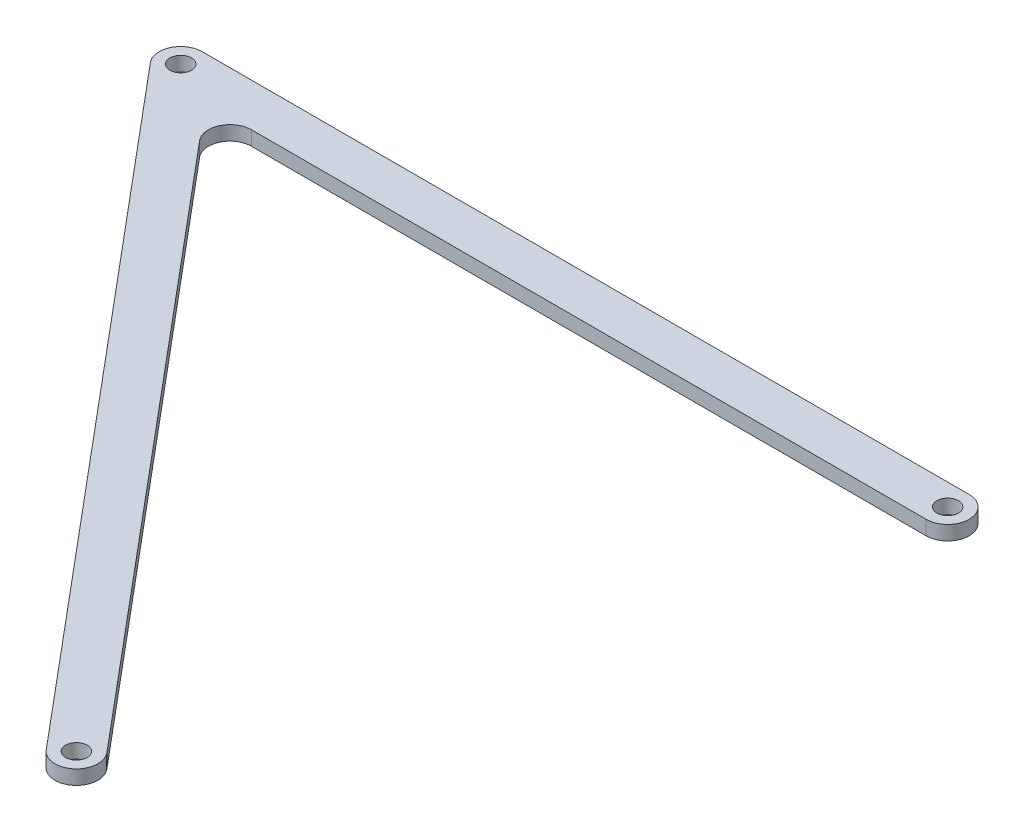
ISO-10303-21;
HEADER;
FILE_DESCRIPTION(('STEP AP214'),'2;1');
FILE_NAME('part.step','',(''),(''),'','','');
FILE_SCHEMA(('AUTOMOTIVE_DESIGN { 1 0 10303 214 1 1 1 1 }'));
ENDSEC;
DATA;
#1=APPLICATION_CONTEXT('core data for automotive mechanical design processes');
#2=APPLICATION_PROTOCOL_DEFINITION('international standard','automotive_design',2000,#1);
#3=PRODUCT_CONTEXT('',#1,'mechanical');
#4=PRODUCT('Part','Part','',(#3));
#5=PRODUCT_RELATED_PRODUCT_CATEGORY('part','',(#4));
#6=PRODUCT_DEFINITION_FORMATION('','',#4);
#7=PRODUCT_DEFINITION_CONTEXT('part definition',#1,'design');
#8=PRODUCT_DEFINITION('design','',#6,#7);
#9=PRODUCT_DEFINITION_SHAPE('','',#8);
#10=(LENGTH_UNIT() NAMED_UNIT(*) SI_UNIT(.MILLI.,.METRE.));
#11=(NAMED_UNIT(*) PLANE_ANGLE_UNIT() SI_UNIT($,.RADIAN.));
#12=(NAMED_UNIT(*) SI_UNIT($,.STERADIAN.) SOLID_ANGLE_UNIT());
#13=UNCERTAINTY_MEASURE_WITH_UNIT(LENGTH_MEASURE(1.E-05),#10,'distance_accuracy_value','');
#14=(GEOMETRIC_REPRESENTATION_CONTEXT(3) GLOBAL_UNCERTAINTY_ASSIGNED_CONTEXT((#13)) GLOBAL_UNIT_ASSIGNED_CONTEXT((#10,
#11,#12)) REPRESENTATION_CONTEXT('',''));
#15=CARTESIAN_POINT('',(0.,0.,0.));
#16=DIRECTION('',(0.,0.,1.));
#17=DIRECTION('',(1.,0.,0.));
#18=AXIS2_PLACEMENT_3D('',#15,#16,#17);
#19=CARTESIAN_POINT('',(0.,0.,0.));
#20=DIRECTION('',(0.,1.,0.));
#21=DIRECTION('',(0.,0.,1.));
#22=AXIS2_PLACEMENT_3D('',#19,#20,#21);
#23=PLANE('',#22);
#24=CARTESIAN_POINT('',(378.815113114848,0.,451.560701066669));
#25=DIRECTION('',(0.,1.,0.));
#26=DIRECTION('',(0.,0.,1.));
#27=AXIS2_PLACEMENT_3D('',#24,#25,#26);
#28=CIRCLE('',#27,7.50000000000001);
#29=CARTESIAN_POINT('',(378.815113114848,0.,459.060701066669));
#30=VERTEX_POINT('',#29);
#31=EDGE_CURVE('E250',#30,#30,#28,.T.);
#32=ORIENTED_EDGE('',*,*,#31,.T.);
#33=EDGE_LOOP('',(#32));
#34=FACE_BOUND('',#33,.T.);
#35=CARTESIAN_POINT('',(535.,0.,0.));
#36=DIRECTION('',(0.,1.,0.));
#37=DIRECTION('',(0.,0.,1.));
#38=AXIS2_PLACEMENT_3D('',#35,#36,#37);
#39=CIRCLE('',#38,7.49999999999996);
#40=CARTESIAN_POINT('',(535.,0.,7.49999999999996));
#41=VERTEX_POINT('',#40);
#42=EDGE_CURVE('E253',#41,#41,#39,.T.);
#43=ORIENTED_EDGE('',*,*,#42,.T.);
#44=EDGE_LOOP('',(#43));
#45=FACE_BOUND('',#44,.T.);
#46=CARTESIAN_POINT('',(0.,0.,0.));
#47=DIRECTION('',(0.,1.,0.));
#48=DIRECTION('',(0.,0.,1.));
#49=AXIS2_PLACEMENT_3D('',#46,#47,#48);
#50=CIRCLE('',#49,7.5);
#51=CARTESIAN_POINT('',(0.,0.,7.5));
#52=VERTEX_POINT('',#51);
#53=EDGE_CURVE('E151',#52,#52,#50,.T.);
#54=ORIENTED_EDGE('',*,*,#53,.T.);
#55=EDGE_LOOP('',(#54));
#56=FACE_BOUND('',#55,.T.);
#57=CARTESIAN_POINT('',(378.815113114848,0.,451.560701066669));
#58=DIRECTION('',(0.,1.,0.));
#59=DIRECTION('',(0.,0.,1.));
#60=AXIS2_PLACEMENT_3D('',#57,#58,#59);
#61=CIRCLE('',#60,15.0000000000001);
#62=CARTESIAN_POINT('',(390.305779761638,0.,441.918886921377));
#63=VERTEX_POINT('',#62);
#64=CARTESIAN_POINT('',(368.296658670312,0.,462.254723513729));
#65=VERTEX_POINT('',#64);
#66=EDGE_CURVE('E113',#63,#65,#61,.F.);
#67=ORIENTED_EDGE('',*,*,#66,.T.);
#68=DIRECTION('',(0.642787609686505,0.,0.766044443119007));
#69=VECTOR('',#68,1.);
#70=CARTESIAN_POINT('',(-11.49066664678,0.,9.641814145298));
#71=LINE('',#70,#69);
#72=CARTESIAN_POINT('',(-11.4906666467812,0.,9.64181414529662));
#73=VERTEX_POINT('',#72);
#74=EDGE_CURVE('E110',#73,#65,#71,.T.);
#75=ORIENTED_EDGE('',*,*,#74,.F.);
#76=CARTESIAN_POINT('',(0.,0.,0.));
#77=DIRECTION('',(0.,1.,0.));
#78=DIRECTION('',(0.,0.,1.));
#79=AXIS2_PLACEMENT_3D('',#76,#77,#78);
#80=CIRCLE('',#79,15.);
#81=CARTESIAN_POINT('',(0.,0.,-15.));
#82=VERTEX_POINT('',#81);
#83=EDGE_CURVE('E98',#82,#73,#80,.T.);
#84=ORIENTED_EDGE('',*,*,#83,.F.);
#85=DIRECTION('',(-1.,0.,0.));
#86=VECTOR('',#85,1.);
#87=CARTESIAN_POINT('',(550.,0.,-15.));
#88=LINE('',#87,#86);
#89=CARTESIAN_POINT('',(535.,0.,-15.));
#90=VERTEX_POINT('',#89);
#91=EDGE_CURVE('E128',#90,#82,#88,.T.);
#92=ORIENTED_EDGE('',*,*,#91,.F.);
#93=CARTESIAN_POINT('',(535.,0.,0.));
#94=DIRECTION('',(0.,-1.,0.));
#95=DIRECTION('',(0.,0.,-1.));
#96=AXIS2_PLACEMENT_3D('',#93,#94,#95);
#97=CIRCLE('',#96,15.);
#98=CARTESIAN_POINT('',(535.,0.,15.));
#99=VERTEX_POINT('',#98);
#100=EDGE_CURVE('E154',#99,#90,#97,.F.);
#101=ORIENTED_EDGE('',*,*,#100,.F.);
#102=DIRECTION('',(1.,0.,0.));
#103=VECTOR('',#102,1.);
#104=CARTESIAN_POINT('',(64.33520761529,0.,15.));
#105=LINE('',#104,#103);
#106=CARTESIAN_POINT('',(64.33520761529,0.,15.));
#107=VERTEX_POINT('',#106);
#108=EDGE_CURVE('E129',#107,#99,#105,.T.);
#109=ORIENTED_EDGE('',*,*,#108,.F.);
#110=CARTESIAN_POINT('',(64.33520761529,0.,30.));
#111=DIRECTION('',(0.,1.,0.));
#112=DIRECTION('',(0.,0.,1.));
#113=AXIS2_PLACEMENT_3D('',#110,#111,#112);
#114=CIRCLE('',#113,15.);
#115=CARTESIAN_POINT('',(52.8445409685073,0.,39.6418141452948));
#116=VERTEX_POINT('',#115);
#117=EDGE_CURVE('E157',#107,#116,#114,.T.);
#118=ORIENTED_EDGE('',*,*,#117,.T.);
#119=DIRECTION('',(-0.642787609686505,0.,-0.766044443119007));
#120=VECTOR('',#119,1.);
#121=CARTESIAN_POINT('',(400.,0.,453.3655796348));
#122=LINE('',#121,#120);
#123=CARTESIAN_POINT('',(390.358185854703,0.,441.874912988015));
#124=VERTEX_POINT('',#123);
#125=EDGE_CURVE('E38',#124,#116,#122,.T.);
#126=ORIENTED_EDGE('',*,*,#125,.F.);
#127=DIRECTION('',(-0.766044443119341,0.,0.642787609686107));
#128=VECTOR('',#127,1.);
#129=CARTESIAN_POINT('',(378.867519207668,0.,451.516727133511));
#130=LINE('',#129,#128);
#131=EDGE_CURVE('E202',#124,#63,#130,.T.);
#132=ORIENTED_EDGE('',*,*,#131,.T.);
#133=EDGE_LOOP('',(#67,#75,#84,#92,#101,#109,#118,#126,#132));
#134=FACE_BOUND('',#133,.T.);
#135=ADVANCED_FACE('F35',(#34,#45,#56,#134),#23,.F.);
#136=CARTESIAN_POINT('',(550.,0.,-15.));
#137=DIRECTION('',(0.,0.,-1.));
#138=DIRECTION('',(-1.,0.,0.));
#139=AXIS2_PLACEMENT_3D('',#136,#137,#138);
#140=PLANE('',#139);
#141=DIRECTION('',(1.,0.,0.));
#142=VECTOR('',#141,1.);
#143=CARTESIAN_POINT('',(0.,10.,-15.));
#144=LINE('',#143,#142);
#145=CARTESIAN_POINT('',(535.,10.,-15.));
#146=VERTEX_POINT('',#145);
#147=CARTESIAN_POINT('',(0.,10.,-15.));
#148=VERTEX_POINT('',#147);
#149=EDGE_CURVE('E150',#146,#148,#144,.F.);
#150=ORIENTED_EDGE('',*,*,#149,.F.);
#151=DIRECTION('',(0.,-1.,0.));
#152=VECTOR('',#151,1.);
#153=CARTESIAN_POINT('',(535.,0.,-15.));
#154=LINE('',#153,#152);
#155=EDGE_CURVE('E131',#90,#146,#154,.F.);
#156=ORIENTED_EDGE('',*,*,#155,.F.);
#157=ORIENTED_EDGE('',*,*,#91,.T.);
#158=DIRECTION('',(0.,1.,0.));
#159=VECTOR('',#158,1.);
#160=CARTESIAN_POINT('',(0.,0.,-15.));
#161=LINE('',#160,#159);
#162=EDGE_CURVE('E105',#148,#82,#161,.F.);
#163=ORIENTED_EDGE('',*,*,#162,.F.);
#164=EDGE_LOOP('',(#150,#156,#157,#163));
#165=FACE_BOUND('',#164,.T.);
#166=ADVANCED_FACE('F205',(#165),#140,.T.);
#167=CARTESIAN_POINT('',(0.,0.,0.));
#168=DIRECTION('',(0.,1.,0.));
#169=DIRECTION('',(0.,0.,1.));
#170=AXIS2_PLACEMENT_3D('',#167,#168,#169);
#171=CYLINDRICAL_SURFACE('',#170,15.);
#172=ORIENTED_EDGE('',*,*,#162,.T.);
#173=ORIENTED_EDGE('',*,*,#83,.T.);
#174=DIRECTION('',(0.,1.,0.));
#175=VECTOR('',#174,1.);
#176=CARTESIAN_POINT('',(-11.49066664678,0.,9.641814145298));
#177=LINE('',#176,#175);
#178=CARTESIAN_POINT('',(-11.4906666467813,10.,9.64181414529646));
#179=VERTEX_POINT('',#178);
#180=EDGE_CURVE('E103',#179,#73,#177,.F.);
#181=ORIENTED_EDGE('',*,*,#180,.F.);
#182=CARTESIAN_POINT('',(0.,10.,0.));
#183=DIRECTION('',(0.,1.,0.));
#184=DIRECTION('',(0.,0.,1.));
#185=AXIS2_PLACEMENT_3D('',#182,#183,#184);
#186=CIRCLE('',#185,15.);
#187=EDGE_CURVE('E148',#148,#179,#186,.T.);
#188=ORIENTED_EDGE('',*,*,#187,.F.);
#189=EDGE_LOOP('',(#172,#173,#181,#188));
#190=FACE_BOUND('',#189,.T.);
#191=ADVANCED_FACE('F100',(#190),#171,.T.);
#192=CARTESIAN_POINT('',(-11.49066664678,0.,9.641814145298));
#193=DIRECTION('',(-0.766044443119007,0.,0.642787609686505));
#194=DIRECTION('',(0.642787609686505,0.,0.766044443119007));
#195=AXIS2_PLACEMENT_3D('',#192,#193,#194);
#196=PLANE('',#195);
#197=DIRECTION('',(0.,1.,0.));
#198=VECTOR('',#197,1.);
#199=CARTESIAN_POINT('',(368.296658670312,-0.000103077695698395,462.254723513729));
#200=LINE('',#199,#198);
#201=CARTESIAN_POINT('',(368.296658670188,10.,462.254723513607));
#202=VERTEX_POINT('',#201);
#203=EDGE_CURVE('E201',#202,#65,#200,.F.);
#204=ORIENTED_EDGE('',*,*,#203,.F.);
#205=DIRECTION('',(0.642787609686484,0.,0.766044443119025));
#206=VECTOR('',#205,1.);
#207=CARTESIAN_POINT('',(-11.49066664678,10.,9.641814145298));
#208=LINE('',#207,#206);
#209=EDGE_CURVE('E120',#179,#202,#208,.T.);
#210=ORIENTED_EDGE('',*,*,#209,.F.);
#211=ORIENTED_EDGE('',*,*,#180,.T.);
#212=ORIENTED_EDGE('',*,*,#74,.T.);
#213=EDGE_LOOP('',(#204,#210,#211,#212));
#214=FACE_BOUND('',#213,.T.);
#215=ADVANCED_FACE('F118',(#214),#196,.T.);
#216=CARTESIAN_POINT('',(400.,0.,453.3655796348));
#217=DIRECTION('',(0.766044443119007,0.,-0.642787609686505));
#218=DIRECTION('',(-0.642787609686505,0.,-0.766044443119007));
#219=AXIS2_PLACEMENT_3D('',#216,#217,#218);
#220=PLANE('',#219);
#221=DIRECTION('',(0.,1.,0.));
#222=VECTOR('',#221,1.);
#223=CARTESIAN_POINT('',(390.358185854703,0.,441.874912988015));
#224=LINE('',#223,#222);
#225=CARTESIAN_POINT('',(390.358185854702,10.,441.874912988015));
#226=VERTEX_POINT('',#225);
#227=EDGE_CURVE('E51',#124,#226,#224,.T.);
#228=ORIENTED_EDGE('',*,*,#227,.F.);
#229=ORIENTED_EDGE('',*,*,#125,.T.);
#230=DIRECTION('',(0.,1.,0.));
#231=VECTOR('',#230,1.);
#232=CARTESIAN_POINT('',(52.8445409685041,0.,39.6418141452966));
#233=LINE('',#232,#231);
#234=CARTESIAN_POINT('',(52.8445409685026,10.,39.6418141452989));
#235=VERTEX_POINT('',#234);
#236=EDGE_CURVE('E125',#116,#235,#233,.T.);
#237=ORIENTED_EDGE('',*,*,#236,.T.);
#238=DIRECTION('',(-0.642787609686523,0.,-0.766044443118992));
#239=VECTOR('',#238,1.);
#240=CARTESIAN_POINT('',(400.,10.,453.3655796348));
#241=LINE('',#240,#239);
#242=EDGE_CURVE('E147',#226,#235,#241,.T.);
#243=ORIENTED_EDGE('',*,*,#242,.F.);
#244=EDGE_LOOP('',(#228,#229,#237,#243));
#245=FACE_BOUND('',#244,.T.);
#246=ADVANCED_FACE('F179',(#245),#220,.T.);
#247=CARTESIAN_POINT('',(64.33520761529,0.,30.));
#248=DIRECTION('',(0.,1.,0.));
#249=DIRECTION('',(0.,0.,1.));
#250=AXIS2_PLACEMENT_3D('',#247,#248,#249);
#251=CYLINDRICAL_SURFACE('',#250,15.);
#252=CARTESIAN_POINT('',(64.33520761529,10.,30.));
#253=DIRECTION('',(0.,1.,0.));
#254=DIRECTION('',(0.,0.,1.));
#255=AXIS2_PLACEMENT_3D('',#252,#253,#254);
#256=CIRCLE('',#255,15.);
#257=CARTESIAN_POINT('',(64.33520761529,10.,15.));
#258=VERTEX_POINT('',#257);
#259=EDGE_CURVE('E144',#235,#258,#256,.F.);
#260=ORIENTED_EDGE('',*,*,#259,.F.);
#261=ORIENTED_EDGE('',*,*,#236,.F.);
#262=ORIENTED_EDGE('',*,*,#117,.F.);
#263=DIRECTION('',(0.,1.,0.));
#264=VECTOR('',#263,1.);
#265=CARTESIAN_POINT('',(64.33520761529,0.,15.));
#266=LINE('',#265,#264);
#267=EDGE_CURVE('E132',#258,#107,#266,.F.);
#268=ORIENTED_EDGE('',*,*,#267,.F.);
#269=EDGE_LOOP('',(#260,#261,#262,#268));
#270=FACE_BOUND('',#269,.T.);
#271=ADVANCED_FACE('F182',(#270),#251,.F.);
#272=CARTESIAN_POINT('',(64.33520761529,0.,15.));
#273=DIRECTION('',(0.,0.,1.));
#274=DIRECTION('',(1.,0.,0.));
#275=AXIS2_PLACEMENT_3D('',#272,#273,#274);
#276=PLANE('',#275);
#277=ORIENTED_EDGE('',*,*,#108,.T.);
#278=DIRECTION('',(0.,-1.,0.));
#279=VECTOR('',#278,1.);
#280=CARTESIAN_POINT('',(535.,0.,15.));
#281=LINE('',#280,#279);
#282=CARTESIAN_POINT('',(535.,10.,15.));
#283=VERTEX_POINT('',#282);
#284=EDGE_CURVE('E60',#283,#99,#281,.T.);
#285=ORIENTED_EDGE('',*,*,#284,.F.);
#286=DIRECTION('',(1.,0.,0.));
#287=VECTOR('',#286,1.);
#288=CARTESIAN_POINT('',(0.,10.,15.));
#289=LINE('',#288,#287);
#290=EDGE_CURVE('E143',#258,#283,#289,.T.);
#291=ORIENTED_EDGE('',*,*,#290,.F.);
#292=ORIENTED_EDGE('',*,*,#267,.T.);
#293=EDGE_LOOP('',(#277,#285,#291,#292));
#294=FACE_BOUND('',#293,.T.);
#295=ADVANCED_FACE('F210',(#294),#276,.T.);
#296=CARTESIAN_POINT('',(535.,0.,0.));
#297=DIRECTION('',(0.,-1.,0.));
#298=DIRECTION('',(0.,0.,-1.));
#299=AXIS2_PLACEMENT_3D('',#296,#297,#298);
#300=CYLINDRICAL_SURFACE('',#299,15.);
#301=ORIENTED_EDGE('',*,*,#284,.T.);
#302=ORIENTED_EDGE('',*,*,#100,.T.);
#303=ORIENTED_EDGE('',*,*,#155,.T.);
#304=CARTESIAN_POINT('',(535.,10.,0.));
#305=DIRECTION('',(0.,-1.,0.));
#306=DIRECTION('',(0.,0.,-1.));
#307=AXIS2_PLACEMENT_3D('',#304,#305,#306);
#308=CIRCLE('',#307,15.);
#309=EDGE_CURVE('E140',#283,#146,#308,.F.);
#310=ORIENTED_EDGE('',*,*,#309,.F.);
#311=EDGE_LOOP('',(#301,#302,#303,#310));
#312=FACE_BOUND('',#311,.T.);
#313=ADVANCED_FACE('F207',(#312),#300,.T.);
#314=CARTESIAN_POINT('',(0.,0.,0.));
#315=DIRECTION('',(0.,1.,0.));
#316=DIRECTION('',(0.,0.,1.));
#317=AXIS2_PLACEMENT_3D('',#314,#315,#316);
#318=CYLINDRICAL_SURFACE('',#317,7.5);
#319=CARTESIAN_POINT('',(0.,10.,0.));
#320=DIRECTION('',(0.,1.,0.));
#321=DIRECTION('',(0.,0.,1.));
#322=AXIS2_PLACEMENT_3D('',#319,#320,#321);
#323=CIRCLE('',#322,7.5);
#324=CARTESIAN_POINT('',(0.,10.,7.5));
#325=VERTEX_POINT('',#324);
#326=EDGE_CURVE('E137',#325,#325,#323,.F.);
#327=ORIENTED_EDGE('',*,*,#326,.F.);
#328=EDGE_LOOP('',(#327));
#329=FACE_BOUND('',#328,.T.);
#330=ORIENTED_EDGE('',*,*,#53,.F.);
#331=EDGE_LOOP('',(#330));
#332=FACE_BOUND('',#331,.T.);
#333=ADVANCED_FACE('F218',(#329,#332),#318,.F.);
#334=CARTESIAN_POINT('',(0.,10.,0.));
#335=DIRECTION('',(0.,1.,0.));
#336=DIRECTION('',(0.,0.,1.));
#337=AXIS2_PLACEMENT_3D('',#334,#335,#336);
#338=PLANE('',#337);
#339=CARTESIAN_POINT('',(378.815113114848,10.,451.560701066669));
#340=DIRECTION('',(0.,1.,0.));
#341=DIRECTION('',(0.,0.,1.));
#342=AXIS2_PLACEMENT_3D('',#339,#340,#341);
#343=CIRCLE('',#342,7.50000000000001);
#344=CARTESIAN_POINT('',(378.815113114848,10.,459.060701066669));
#345=VERTEX_POINT('',#344);
#346=EDGE_CURVE('E252',#345,#345,#343,.T.);
#347=ORIENTED_EDGE('',*,*,#346,.F.);
#348=EDGE_LOOP('',(#347));
#349=FACE_BOUND('',#348,.T.);
#350=CARTESIAN_POINT('',(535.,10.,0.));
#351=DIRECTION('',(0.,1.,0.));
#352=DIRECTION('',(0.,0.,1.));
#353=AXIS2_PLACEMENT_3D('',#350,#351,#352);
#354=CIRCLE('',#353,7.49999999999996);
#355=CARTESIAN_POINT('',(535.,10.,7.49999999999996));
#356=VERTEX_POINT('',#355);
#357=EDGE_CURVE('E257',#356,#356,#354,.T.);
#358=ORIENTED_EDGE('',*,*,#357,.F.);
#359=EDGE_LOOP('',(#358));
#360=FACE_BOUND('',#359,.T.);
#361=CARTESIAN_POINT('',(378.815113114848,10.,451.560701066669));
#362=DIRECTION('',(0.,1.,0.));
#363=DIRECTION('',(0.,0.,1.));
#364=AXIS2_PLACEMENT_3D('',#361,#362,#363);
#365=CIRCLE('',#364,15.0000000000001);
#366=CARTESIAN_POINT('',(390.305779761638,10.,441.918886921377));
#367=VERTEX_POINT('',#366);
#368=EDGE_CURVE('E11',#367,#202,#365,.F.);
#369=ORIENTED_EDGE('',*,*,#368,.F.);
#370=DIRECTION('',(-0.766044443119341,0.,0.642787609686107));
#371=VECTOR('',#370,1.);
#372=CARTESIAN_POINT('',(378.867519207668,10.,451.516727133511));
#373=LINE('',#372,#371);
#374=EDGE_CURVE('E44',#226,#367,#373,.T.);
#375=ORIENTED_EDGE('',*,*,#374,.F.);
#376=ORIENTED_EDGE('',*,*,#242,.T.);
#377=ORIENTED_EDGE('',*,*,#259,.T.);
#378=ORIENTED_EDGE('',*,*,#290,.T.);
#379=ORIENTED_EDGE('',*,*,#309,.T.);
#380=ORIENTED_EDGE('',*,*,#149,.T.);
#381=ORIENTED_EDGE('',*,*,#187,.T.);
#382=ORIENTED_EDGE('',*,*,#209,.T.);
#383=EDGE_LOOP('',(#369,#375,#376,#377,#378,#379,#380,#381,#382));
#384=FACE_BOUND('',#383,.T.);
#385=ORIENTED_EDGE('',*,*,#326,.T.);
#386=EDGE_LOOP('',(#385));
#387=FACE_BOUND('',#386,.T.);
#388=ADVANCED_FACE('F186',(#349,#360,#384,#387),#338,.T.);
#389=CARTESIAN_POINT('',(378.815113114848,-0.000103077695698395,451.560701066669));
#390=DIRECTION('',(0.,1.,0.));
#391=DIRECTION('',(0.,0.,1.));
#392=AXIS2_PLACEMENT_3D('',#389,#390,#391);
#393=CYLINDRICAL_SURFACE('',#392,15.0000000000001);
#394=DIRECTION('',(0.,1.,0.));
#395=VECTOR('',#394,1.);
#396=CARTESIAN_POINT('',(390.305779761638,-0.000103077695698395,441.918886921377));
#397=LINE('',#396,#395);
#398=EDGE_CURVE('E193',#63,#367,#397,.T.);
#399=ORIENTED_EDGE('',*,*,#398,.T.);
#400=ORIENTED_EDGE('',*,*,#368,.T.);
#401=ORIENTED_EDGE('',*,*,#203,.T.);
#402=ORIENTED_EDGE('',*,*,#66,.F.);
#403=EDGE_LOOP('',(#399,#400,#401,#402));
#404=FACE_BOUND('',#403,.T.);
#405=ADVANCED_FACE('F200',(#404),#393,.T.);
#406=CARTESIAN_POINT('',(390.305779761638,-0.000103077695698395,441.918886921377));
#407=DIRECTION('',(-0.642787609686107,0.,-0.766044443119341));
#408=DIRECTION('',(-0.766044443119341,0.,0.642787609686107));
#409=AXIS2_PLACEMENT_3D('',#406,#407,#408);
#410=PLANE('',#409);
#411=ORIENTED_EDGE('',*,*,#227,.T.);
#412=ORIENTED_EDGE('',*,*,#374,.T.);
#413=ORIENTED_EDGE('',*,*,#398,.F.);
#414=ORIENTED_EDGE('',*,*,#131,.F.);
#415=EDGE_LOOP('',(#411,#412,#413,#414));
#416=FACE_BOUND('',#415,.T.);
#417=ADVANCED_FACE('F191',(#416),#410,.F.);
#418=CARTESIAN_POINT('',(535.,0.,0.));
#419=DIRECTION('',(0.,1.,0.));
#420=DIRECTION('',(0.,0.,1.));
#421=AXIS2_PLACEMENT_3D('',#418,#419,#420);
#422=CYLINDRICAL_SURFACE('',#421,7.49999999999996);
#423=ORIENTED_EDGE('',*,*,#42,.F.);
#424=EDGE_LOOP('',(#423));
#425=FACE_BOUND('',#424,.T.);
#426=ORIENTED_EDGE('',*,*,#357,.T.);
#427=EDGE_LOOP('',(#426));
#428=FACE_BOUND('',#427,.T.);
#429=ADVANCED_FACE('F237',(#425,#428),#422,.F.);
#430=CARTESIAN_POINT('',(378.815113114848,0.,451.560701066669));
#431=DIRECTION('',(0.,1.,0.));
#432=DIRECTION('',(0.,0.,1.));
#433=AXIS2_PLACEMENT_3D('',#430,#431,#432);
#434=CYLINDRICAL_SURFACE('',#433,7.50000000000001);
#435=ORIENTED_EDGE('',*,*,#31,.F.);
#436=EDGE_LOOP('',(#435));
#437=FACE_BOUND('',#436,.T.);
#438=ORIENTED_EDGE('',*,*,#346,.T.);
#439=EDGE_LOOP('',(#438));
#440=FACE_BOUND('',#439,.T.);
#441=ADVANCED_FACE('F241',(#437,#440),#434,.F.);
#442=CLOSED_SHELL('',(#135,#166,#191,#215,#246,#271,#295,#313,#333,#388,#405,#417,#429,#441));
#443=MANIFOLD_SOLID_BREP('B2',#442);
#444=ADVANCED_BREP_SHAPE_REPRESENTATION('',(#18,#443),#14);
#445=SHAPE_DEFINITION_REPRESENTATION(#9,#444);
ENDSEC;
END-ISO-10303-21;
